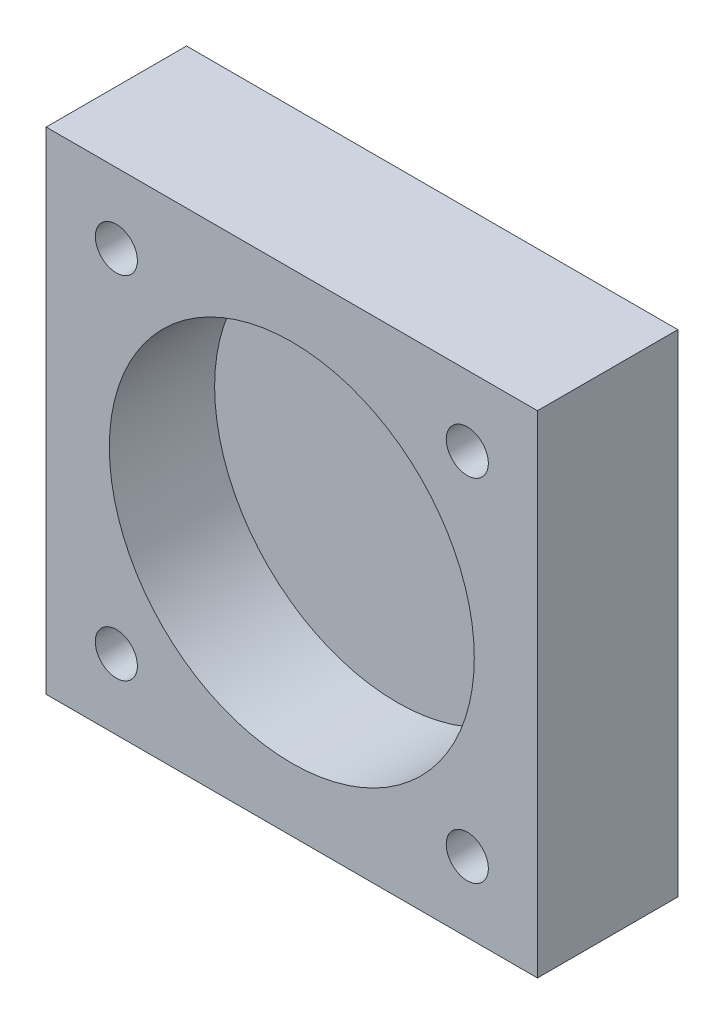
ISO-10303-21;
HEADER;
FILE_DESCRIPTION(('STEP AP214'),'2;1');
FILE_NAME('part.step','',(''),(''),'','','');
FILE_SCHEMA(('AUTOMOTIVE_DESIGN { 1 0 10303 214 1 1 1 1 }'));
ENDSEC;
DATA;
#1=APPLICATION_CONTEXT('core data for automotive mechanical design processes');
#2=APPLICATION_PROTOCOL_DEFINITION('international standard','automotive_design',2000,#1);
#3=PRODUCT_CONTEXT('',#1,'mechanical');
#4=PRODUCT('Part','Part','',(#3));
#5=PRODUCT_RELATED_PRODUCT_CATEGORY('part','',(#4));
#6=PRODUCT_DEFINITION_FORMATION('','',#4);
#7=PRODUCT_DEFINITION_CONTEXT('part definition',#1,'design');
#8=PRODUCT_DEFINITION('design','',#6,#7);
#9=PRODUCT_DEFINITION_SHAPE('','',#8);
#10=(LENGTH_UNIT() NAMED_UNIT(*) SI_UNIT(.MILLI.,.METRE.));
#11=(NAMED_UNIT(*) PLANE_ANGLE_UNIT() SI_UNIT($,.RADIAN.));
#12=(NAMED_UNIT(*) SI_UNIT($,.STERADIAN.) SOLID_ANGLE_UNIT());
#13=UNCERTAINTY_MEASURE_WITH_UNIT(LENGTH_MEASURE(1.E-05),#10,'distance_accuracy_value','');
#14=(GEOMETRIC_REPRESENTATION_CONTEXT(3) GLOBAL_UNCERTAINTY_ASSIGNED_CONTEXT((#13)) GLOBAL_UNIT_ASSIGNED_CONTEXT((#10,
#11,#12)) REPRESENTATION_CONTEXT('',''));
#15=CARTESIAN_POINT('',(0.,0.,0.));
#16=DIRECTION('',(0.,0.,1.));
#17=DIRECTION('',(1.,0.,0.));
#18=AXIS2_PLACEMENT_3D('',#15,#16,#17);
#19=CARTESIAN_POINT('',(0.,0.,0.));
#20=DIRECTION('',(0.,0.,-1.));
#21=DIRECTION('',(-1.,0.,0.));
#22=AXIS2_PLACEMENT_3D('',#19,#20,#21);
#23=PLANE('',#22);
#24=CARTESIAN_POINT('',(25.,-25.,0.));
#25=DIRECTION('',(0.,0.,-1.));
#26=DIRECTION('',(-1.,0.,0.));
#27=AXIS2_PLACEMENT_3D('',#24,#25,#26);
#28=CIRCLE('',#27,3.);
#29=CARTESIAN_POINT('',(22.,-25.,0.));
#30=VERTEX_POINT('',#29);
#31=EDGE_CURVE('E148',#30,#30,#28,.T.);
#32=ORIENTED_EDGE('',*,*,#31,.T.);
#33=EDGE_LOOP('',(#32));
#34=FACE_BOUND('',#33,.T.);
#35=CARTESIAN_POINT('',(-25.,-25.,0.));
#36=DIRECTION('',(0.,0.,-1.));
#37=DIRECTION('',(-1.,0.,0.));
#38=AXIS2_PLACEMENT_3D('',#35,#36,#37);
#39=CIRCLE('',#38,3.);
#40=CARTESIAN_POINT('',(-28.,-25.,0.));
#41=VERTEX_POINT('',#40);
#42=EDGE_CURVE('E155',#41,#41,#39,.T.);
#43=ORIENTED_EDGE('',*,*,#42,.T.);
#44=EDGE_LOOP('',(#43));
#45=FACE_BOUND('',#44,.T.);
#46=CARTESIAN_POINT('',(-25.,25.,0.));
#47=DIRECTION('',(0.,0.,-1.));
#48=DIRECTION('',(-1.,0.,0.));
#49=AXIS2_PLACEMENT_3D('',#46,#47,#48);
#50=CIRCLE('',#49,3.);
#51=CARTESIAN_POINT('',(-28.,25.,0.));
#52=VERTEX_POINT('',#51);
#53=EDGE_CURVE('E261',#52,#52,#50,.T.);
#54=ORIENTED_EDGE('',*,*,#53,.T.);
#55=EDGE_LOOP('',(#54));
#56=FACE_BOUND('',#55,.T.);
#57=CARTESIAN_POINT('',(25.,25.,0.));
#58=DIRECTION('',(0.,0.,-1.));
#59=DIRECTION('',(-1.,0.,0.));
#60=AXIS2_PLACEMENT_3D('',#57,#58,#59);
#61=CIRCLE('',#60,3.);
#62=CARTESIAN_POINT('',(22.,25.,0.));
#63=VERTEX_POINT('',#62);
#64=EDGE_CURVE('E264',#63,#63,#61,.T.);
#65=ORIENTED_EDGE('',*,*,#64,.T.);
#66=EDGE_LOOP('',(#65));
#67=FACE_BOUND('',#66,.T.);
#68=DIRECTION('',(0.,1.,0.));
#69=VECTOR('',#68,1.);
#70=CARTESIAN_POINT('',(35.,-35.,0.));
#71=LINE('',#70,#69);
#72=CARTESIAN_POINT('',(35.,-35.,0.));
#73=VERTEX_POINT('',#72);
#74=CARTESIAN_POINT('',(35.,35.,0.));
#75=VERTEX_POINT('',#74);
#76=EDGE_CURVE('E124',#73,#75,#71,.T.);
#77=ORIENTED_EDGE('',*,*,#76,.T.);
#78=DIRECTION('',(-1.,0.,0.));
#79=VECTOR('',#78,1.);
#80=CARTESIAN_POINT('',(-35.,35.,0.));
#81=LINE('',#80,#79);
#82=CARTESIAN_POINT('',(-35.,35.,0.));
#83=VERTEX_POINT('',#82);
#84=EDGE_CURVE('E122',#75,#83,#81,.T.);
#85=ORIENTED_EDGE('',*,*,#84,.T.);
#86=DIRECTION('',(0.,-1.,0.));
#87=VECTOR('',#86,1.);
#88=CARTESIAN_POINT('',(-35.,-35.,0.));
#89=LINE('',#88,#87);
#90=CARTESIAN_POINT('',(-35.,-35.,0.));
#91=VERTEX_POINT('',#90);
#92=EDGE_CURVE('E99',#83,#91,#89,.T.);
#93=ORIENTED_EDGE('',*,*,#92,.T.);
#94=DIRECTION('',(1.,0.,0.));
#95=VECTOR('',#94,1.);
#96=CARTESIAN_POINT('',(-35.,-35.,0.));
#97=LINE('',#96,#95);
#98=EDGE_CURVE('E113',#91,#73,#97,.T.);
#99=ORIENTED_EDGE('',*,*,#98,.T.);
#100=EDGE_LOOP('',(#77,#85,#93,#99));
#101=FACE_BOUND('',#100,.T.);
#102=CARTESIAN_POINT('',(0.,0.,1.2E-05));
#103=DIRECTION('',(0.,0.,1.));
#104=DIRECTION('',(1.,0.,0.));
#105=AXIS2_PLACEMENT_3D('',#102,#103,#104);
#106=CIRCLE('',#105,26.);
#107=CARTESIAN_POINT('',(26.,0.,1.2E-05));
#108=VERTEX_POINT('',#107);
#109=EDGE_CURVE('E127',#108,#108,#106,.T.);
#110=ORIENTED_EDGE('',*,*,#109,.F.);
#111=EDGE_LOOP('',(#110));
#112=FACE_BOUND('',#111,.T.);
#113=ADVANCED_FACE('F44',(#34,#45,#56,#67,#101,#112),#23,.F.);
#114=CARTESIAN_POINT('',(35.,-35.,-20.));
#115=DIRECTION('',(1.,0.,0.));
#116=DIRECTION('',(0.,0.,-1.));
#117=AXIS2_PLACEMENT_3D('',#114,#115,#116);
#118=PLANE('',#117);
#119=ORIENTED_EDGE('',*,*,#76,.F.);
#120=DIRECTION('',(0.,0.,1.));
#121=VECTOR('',#120,1.);
#122=CARTESIAN_POINT('',(35.,-35.,-20.));
#123=LINE('',#122,#121);
#124=CARTESIAN_POINT('',(35.,-35.,-20.));
#125=VERTEX_POINT('',#124);
#126=EDGE_CURVE('E11',#125,#73,#123,.T.);
#127=ORIENTED_EDGE('',*,*,#126,.F.);
#128=DIRECTION('',(0.,1.,0.));
#129=VECTOR('',#128,1.);
#130=CARTESIAN_POINT('',(35.,-35.,-20.));
#131=LINE('',#130,#129);
#132=CARTESIAN_POINT('',(35.,35.,-20.));
#133=VERTEX_POINT('',#132);
#134=EDGE_CURVE('E115',#125,#133,#131,.T.);
#135=ORIENTED_EDGE('',*,*,#134,.T.);
#136=DIRECTION('',(0.,0.,1.));
#137=VECTOR('',#136,1.);
#138=CARTESIAN_POINT('',(35.,35.,-20.));
#139=LINE('',#138,#137);
#140=EDGE_CURVE('E95',#133,#75,#139,.T.);
#141=ORIENTED_EDGE('',*,*,#140,.T.);
#142=EDGE_LOOP('',(#119,#127,#135,#141));
#143=FACE_BOUND('',#142,.T.);
#144=ADVANCED_FACE('F50',(#143),#118,.T.);
#145=CARTESIAN_POINT('',(-35.,-35.,-20.));
#146=DIRECTION('',(0.,-1.,0.));
#147=DIRECTION('',(0.,0.,-1.));
#148=AXIS2_PLACEMENT_3D('',#145,#146,#147);
#149=PLANE('',#148);
#150=ORIENTED_EDGE('',*,*,#98,.F.);
#151=DIRECTION('',(0.,0.,1.));
#152=VECTOR('',#151,1.);
#153=CARTESIAN_POINT('',(-35.,-35.,-20.));
#154=LINE('',#153,#152);
#155=CARTESIAN_POINT('',(-35.,-35.,-20.));
#156=VERTEX_POINT('',#155);
#157=EDGE_CURVE('E59',#156,#91,#154,.T.);
#158=ORIENTED_EDGE('',*,*,#157,.F.);
#159=DIRECTION('',(1.,0.,0.));
#160=VECTOR('',#159,1.);
#161=CARTESIAN_POINT('',(-35.,-35.,-20.));
#162=LINE('',#161,#160);
#163=EDGE_CURVE('E110',#156,#125,#162,.T.);
#164=ORIENTED_EDGE('',*,*,#163,.T.);
#165=ORIENTED_EDGE('',*,*,#126,.T.);
#166=EDGE_LOOP('',(#150,#158,#164,#165));
#167=FACE_BOUND('',#166,.T.);
#168=ADVANCED_FACE('F179',(#167),#149,.T.);
#169=CARTESIAN_POINT('',(-35.,-35.,-20.));
#170=DIRECTION('',(-1.,0.,0.));
#171=DIRECTION('',(0.,0.,1.));
#172=AXIS2_PLACEMENT_3D('',#169,#170,#171);
#173=PLANE('',#172);
#174=ORIENTED_EDGE('',*,*,#92,.F.);
#175=DIRECTION('',(0.,0.,1.));
#176=VECTOR('',#175,1.);
#177=CARTESIAN_POINT('',(-35.,35.,-20.));
#178=LINE('',#177,#176);
#179=CARTESIAN_POINT('',(-35.,35.,-20.));
#180=VERTEX_POINT('',#179);
#181=EDGE_CURVE('E92',#180,#83,#178,.T.);
#182=ORIENTED_EDGE('',*,*,#181,.F.);
#183=DIRECTION('',(0.,-1.,0.));
#184=VECTOR('',#183,1.);
#185=CARTESIAN_POINT('',(-35.,-35.,-20.));
#186=LINE('',#185,#184);
#187=EDGE_CURVE('E98',#180,#156,#186,.T.);
#188=ORIENTED_EDGE('',*,*,#187,.T.);
#189=ORIENTED_EDGE('',*,*,#157,.T.);
#190=EDGE_LOOP('',(#174,#182,#188,#189));
#191=FACE_BOUND('',#190,.T.);
#192=ADVANCED_FACE('F100',(#191),#173,.T.);
#193=CARTESIAN_POINT('',(-35.,35.,-20.));
#194=DIRECTION('',(0.,1.,0.));
#195=DIRECTION('',(0.,0.,1.));
#196=AXIS2_PLACEMENT_3D('',#193,#194,#195);
#197=PLANE('',#196);
#198=ORIENTED_EDGE('',*,*,#84,.F.);
#199=ORIENTED_EDGE('',*,*,#140,.F.);
#200=DIRECTION('',(-1.,0.,0.));
#201=VECTOR('',#200,1.);
#202=CARTESIAN_POINT('',(-35.,35.,-20.));
#203=LINE('',#202,#201);
#204=EDGE_CURVE('E106',#133,#180,#203,.T.);
#205=ORIENTED_EDGE('',*,*,#204,.T.);
#206=ORIENTED_EDGE('',*,*,#181,.T.);
#207=EDGE_LOOP('',(#198,#199,#205,#206));
#208=FACE_BOUND('',#207,.T.);
#209=ADVANCED_FACE('F109',(#208),#197,.T.);
#210=CARTESIAN_POINT('',(0.,0.,-20.));
#211=DIRECTION('',(0.,0.,-1.));
#212=DIRECTION('',(-1.,0.,0.));
#213=AXIS2_PLACEMENT_3D('',#210,#211,#212);
#214=PLANE('',#213);
#215=CARTESIAN_POINT('',(25.,-25.,-20.));
#216=DIRECTION('',(0.,0.,-1.));
#217=DIRECTION('',(-1.,0.,0.));
#218=AXIS2_PLACEMENT_3D('',#215,#216,#217);
#219=CIRCLE('',#218,3.);
#220=CARTESIAN_POINT('',(22.,-25.,-20.));
#221=VERTEX_POINT('',#220);
#222=EDGE_CURVE('E252',#221,#221,#219,.T.);
#223=ORIENTED_EDGE('',*,*,#222,.F.);
#224=EDGE_LOOP('',(#223));
#225=FACE_BOUND('',#224,.T.);
#226=CARTESIAN_POINT('',(-25.,-25.,-20.));
#227=DIRECTION('',(0.,0.,-1.));
#228=DIRECTION('',(-1.,0.,0.));
#229=AXIS2_PLACEMENT_3D('',#226,#227,#228);
#230=CIRCLE('',#229,3.);
#231=CARTESIAN_POINT('',(-28.,-25.,-20.));
#232=VERTEX_POINT('',#231);
#233=EDGE_CURVE('E296',#232,#232,#230,.T.);
#234=ORIENTED_EDGE('',*,*,#233,.F.);
#235=EDGE_LOOP('',(#234));
#236=FACE_BOUND('',#235,.T.);
#237=CARTESIAN_POINT('',(-25.,25.,-20.));
#238=DIRECTION('',(0.,0.,-1.));
#239=DIRECTION('',(-1.,0.,0.));
#240=AXIS2_PLACEMENT_3D('',#237,#238,#239);
#241=CIRCLE('',#240,3.);
#242=CARTESIAN_POINT('',(-28.,25.,-20.));
#243=VERTEX_POINT('',#242);
#244=EDGE_CURVE('E291',#243,#243,#241,.T.);
#245=ORIENTED_EDGE('',*,*,#244,.F.);
#246=EDGE_LOOP('',(#245));
#247=FACE_BOUND('',#246,.T.);
#248=CARTESIAN_POINT('',(25.,25.,-20.));
#249=DIRECTION('',(0.,0.,-1.));
#250=DIRECTION('',(-1.,0.,0.));
#251=AXIS2_PLACEMENT_3D('',#248,#249,#250);
#252=CIRCLE('',#251,3.);
#253=CARTESIAN_POINT('',(22.,25.,-20.));
#254=VERTEX_POINT('',#253);
#255=EDGE_CURVE('E286',#254,#254,#252,.T.);
#256=ORIENTED_EDGE('',*,*,#255,.F.);
#257=EDGE_LOOP('',(#256));
#258=FACE_BOUND('',#257,.T.);
#259=ORIENTED_EDGE('',*,*,#134,.F.);
#260=ORIENTED_EDGE('',*,*,#163,.F.);
#261=ORIENTED_EDGE('',*,*,#187,.F.);
#262=ORIENTED_EDGE('',*,*,#204,.F.);
#263=EDGE_LOOP('',(#259,#260,#261,#262));
#264=FACE_BOUND('',#263,.T.);
#265=ADVANCED_FACE('F104',(#225,#236,#247,#258,#264),#214,.T.);
#266=CARTESIAN_POINT('',(0.,0.,1.2E-05));
#267=DIRECTION('',(0.,0.,-1.));
#268=DIRECTION('',(-1.,0.,0.));
#269=AXIS2_PLACEMENT_3D('',#266,#267,#268);
#270=CYLINDRICAL_SURFACE('',#269,26.);
#271=ORIENTED_EDGE('',*,*,#109,.T.);
#272=EDGE_LOOP('',(#271));
#273=FACE_BOUND('',#272,.T.);
#274=CARTESIAN_POINT('',(0.,0.,-15.));
#275=DIRECTION('',(0.,0.,1.));
#276=DIRECTION('',(1.,0.,0.));
#277=AXIS2_PLACEMENT_3D('',#274,#275,#276);
#278=CIRCLE('',#277,26.);
#279=CARTESIAN_POINT('',(26.,0.,-15.));
#280=VERTEX_POINT('',#279);
#281=EDGE_CURVE('E141',#280,#280,#278,.T.);
#282=ORIENTED_EDGE('',*,*,#281,.F.);
#283=EDGE_LOOP('',(#282));
#284=FACE_BOUND('',#283,.T.);
#285=ADVANCED_FACE('F158',(#273,#284),#270,.F.);
#286=CARTESIAN_POINT('',(0.,0.,-15.));
#287=DIRECTION('',(0.,0.,1.));
#288=DIRECTION('',(1.,0.,0.));
#289=AXIS2_PLACEMENT_3D('',#286,#287,#288);
#290=PLANE('',#289);
#291=ORIENTED_EDGE('',*,*,#281,.T.);
#292=EDGE_LOOP('',(#291));
#293=FACE_BOUND('',#292,.T.);
#294=ADVANCED_FACE('F169',(#293),#290,.T.);
#295=CARTESIAN_POINT('',(25.,25.,0.549594709516019));
#296=DIRECTION('',(0.,0.,-1.));
#297=DIRECTION('',(-1.,0.,0.));
#298=AXIS2_PLACEMENT_3D('',#295,#296,#297);
#299=CYLINDRICAL_SURFACE('',#298,3.);
#300=ORIENTED_EDGE('',*,*,#255,.T.);
#301=EDGE_LOOP('',(#300));
#302=FACE_BOUND('',#301,.T.);
#303=ORIENTED_EDGE('',*,*,#64,.F.);
#304=EDGE_LOOP('',(#303));
#305=FACE_BOUND('',#304,.T.);
#306=ADVANCED_FACE('F196',(#302,#305),#299,.F.);
#307=CARTESIAN_POINT('',(-25.,25.,0.549594709516019));
#308=DIRECTION('',(0.,0.,-1.));
#309=DIRECTION('',(-1.,0.,0.));
#310=AXIS2_PLACEMENT_3D('',#307,#308,#309);
#311=CYLINDRICAL_SURFACE('',#310,3.);
#312=ORIENTED_EDGE('',*,*,#244,.T.);
#313=EDGE_LOOP('',(#312));
#314=FACE_BOUND('',#313,.T.);
#315=ORIENTED_EDGE('',*,*,#53,.F.);
#316=EDGE_LOOP('',(#315));
#317=FACE_BOUND('',#316,.T.);
#318=ADVANCED_FACE('F213',(#314,#317),#311,.F.);
#319=CARTESIAN_POINT('',(-25.,-25.,0.549594709516019));
#320=DIRECTION('',(0.,0.,-1.));
#321=DIRECTION('',(-1.,0.,0.));
#322=AXIS2_PLACEMENT_3D('',#319,#320,#321);
#323=CYLINDRICAL_SURFACE('',#322,3.);
#324=ORIENTED_EDGE('',*,*,#233,.T.);
#325=EDGE_LOOP('',(#324));
#326=FACE_BOUND('',#325,.T.);
#327=ORIENTED_EDGE('',*,*,#42,.F.);
#328=EDGE_LOOP('',(#327));
#329=FACE_BOUND('',#328,.T.);
#330=ADVANCED_FACE('F222',(#326,#329),#323,.F.);
#331=CARTESIAN_POINT('',(25.,-25.,0.549594709516019));
#332=DIRECTION('',(0.,0.,-1.));
#333=DIRECTION('',(-1.,0.,0.));
#334=AXIS2_PLACEMENT_3D('',#331,#332,#333);
#335=CYLINDRICAL_SURFACE('',#334,3.);
#336=ORIENTED_EDGE('',*,*,#222,.T.);
#337=EDGE_LOOP('',(#336));
#338=FACE_BOUND('',#337,.T.);
#339=ORIENTED_EDGE('',*,*,#31,.F.);
#340=EDGE_LOOP('',(#339));
#341=FACE_BOUND('',#340,.T.);
#342=ADVANCED_FACE('F228',(#338,#341),#335,.F.);
#343=CLOSED_SHELL('',(#113,#144,#168,#192,#209,#265,#285,#294,#306,#318,#330,#342));
#344=MANIFOLD_SOLID_BREP('B2',#343);
#345=ADVANCED_BREP_SHAPE_REPRESENTATION('',(#18,#344),#14);
#346=SHAPE_DEFINITION_REPRESENTATION(#9,#345);
ENDSEC;
END-ISO-10303-21;
